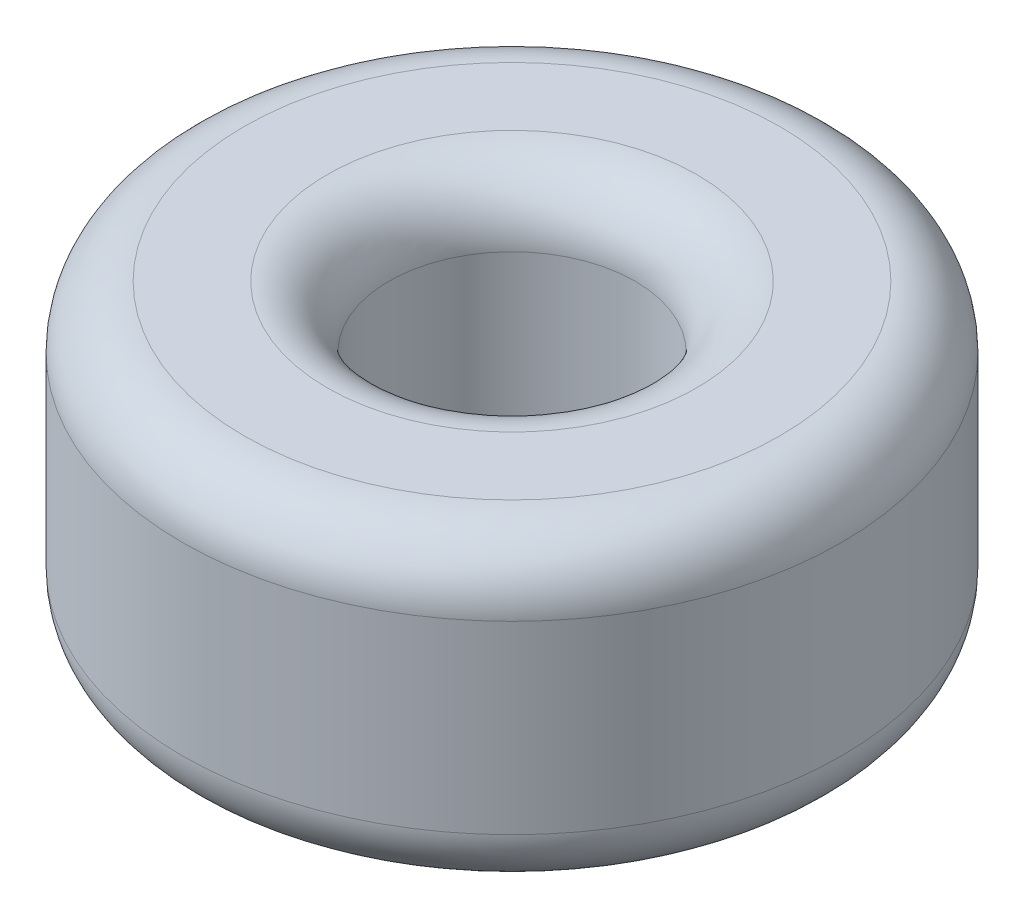
ISO-10303-21;
HEADER;
FILE_DESCRIPTION(('STEP AP214'),'2;1');
FILE_NAME('part.step','',(''),(''),'','','');
FILE_SCHEMA(('AUTOMOTIVE_DESIGN { 1 0 10303 214 1 1 1 1 }'));
ENDSEC;
DATA;
#1=APPLICATION_CONTEXT('core data for automotive mechanical design processes');
#2=APPLICATION_PROTOCOL_DEFINITION('international standard','automotive_design',2000,#1);
#3=PRODUCT_CONTEXT('',#1,'mechanical');
#4=PRODUCT('Part','Part','',(#3));
#5=PRODUCT_RELATED_PRODUCT_CATEGORY('part','',(#4));
#6=PRODUCT_DEFINITION_FORMATION('','',#4);
#7=PRODUCT_DEFINITION_CONTEXT('part definition',#1,'design');
#8=PRODUCT_DEFINITION('design','',#6,#7);
#9=PRODUCT_DEFINITION_SHAPE('','',#8);
#10=(LENGTH_UNIT() NAMED_UNIT(*) SI_UNIT(.MILLI.,.METRE.));
#11=(NAMED_UNIT(*) PLANE_ANGLE_UNIT() SI_UNIT($,.RADIAN.));
#12=(NAMED_UNIT(*) SI_UNIT($,.STERADIAN.) SOLID_ANGLE_UNIT());
#13=UNCERTAINTY_MEASURE_WITH_UNIT(LENGTH_MEASURE(1.E-05),#10,'distance_accuracy_value','');
#14=(GEOMETRIC_REPRESENTATION_CONTEXT(3) GLOBAL_UNCERTAINTY_ASSIGNED_CONTEXT((#13)) GLOBAL_UNIT_ASSIGNED_CONTEXT((#10,
#11,#12)) REPRESENTATION_CONTEXT('',''));
#15=CARTESIAN_POINT('',(0.,0.,0.));
#16=DIRECTION('',(0.,0.,1.));
#17=DIRECTION('',(1.,0.,0.));
#18=AXIS2_PLACEMENT_3D('',#15,#16,#17);
#19=CARTESIAN_POINT('',(0.,50.,0.));
#20=DIRECTION('',(0.,1.,0.));
#21=DIRECTION('',(0.,0.,1.));
#22=AXIS2_PLACEMENT_3D('',#19,#20,#21);
#23=PLANE('',#22);
#24=CARTESIAN_POINT('',(0.,50.,0.));
#25=DIRECTION('',(0.,1.,0.));
#26=DIRECTION('',(0.,0.,1.));
#27=AXIS2_PLACEMENT_3D('',#24,#25,#26);
#28=CIRCLE('',#27,43.5);
#29=CARTESIAN_POINT('',(0.,50.,43.5));
#30=VERTEX_POINT('',#29);
#31=EDGE_CURVE('E10',#30,#30,#28,.T.);
#32=ORIENTED_EDGE('',*,*,#31,.T.);
#33=EDGE_LOOP('',(#32));
#34=FACE_BOUND('',#33,.T.);
#35=CARTESIAN_POINT('',(0.,50.,0.));
#36=DIRECTION('',(0.,1.,0.));
#37=DIRECTION('',(0.,0.,1.));
#38=AXIS2_PLACEMENT_3D('',#35,#36,#37);
#39=CIRCLE('',#38,30.);
#40=CARTESIAN_POINT('',(0.,50.,30.));
#41=VERTEX_POINT('',#40);
#42=EDGE_CURVE('E38',#41,#41,#39,.F.);
#43=ORIENTED_EDGE('',*,*,#42,.T.);
#44=EDGE_LOOP('',(#43));
#45=FACE_BOUND('',#44,.T.);
#46=ADVANCED_FACE('F31',(#34,#45),#23,.T.);
#47=CARTESIAN_POINT('',(0.,0.,0.));
#48=DIRECTION('',(0.,1.,0.));
#49=DIRECTION('',(0.,0.,1.));
#50=AXIS2_PLACEMENT_3D('',#47,#48,#49);
#51=PLANE('',#50);
#52=CARTESIAN_POINT('',(0.,0.,0.));
#53=DIRECTION('',(0.,1.,0.));
#54=DIRECTION('',(0.,0.,1.));
#55=AXIS2_PLACEMENT_3D('',#52,#53,#54);
#56=CIRCLE('',#55,43.5);
#57=CARTESIAN_POINT('',(0.,0.,43.5));
#58=VERTEX_POINT('',#57);
#59=EDGE_CURVE('E51',#58,#58,#56,.F.);
#60=ORIENTED_EDGE('',*,*,#59,.T.);
#61=EDGE_LOOP('',(#60));
#62=FACE_BOUND('',#61,.T.);
#63=CARTESIAN_POINT('',(0.,0.,0.));
#64=DIRECTION('',(0.,1.,0.));
#65=DIRECTION('',(0.,0.,1.));
#66=AXIS2_PLACEMENT_3D('',#63,#64,#65);
#67=CIRCLE('',#66,30.);
#68=CARTESIAN_POINT('',(0.,0.,30.));
#69=VERTEX_POINT('',#68);
#70=EDGE_CURVE('E54',#69,#69,#67,.T.);
#71=ORIENTED_EDGE('',*,*,#70,.T.);
#72=EDGE_LOOP('',(#71));
#73=FACE_BOUND('',#72,.T.);
#74=ADVANCED_FACE('F79',(#62,#73),#51,.F.);
#75=CARTESIAN_POINT('',(0.,50.,0.));
#76=DIRECTION('',(0.,-1.,0.));
#77=DIRECTION('',(0.,0.,-1.));
#78=AXIS2_PLACEMENT_3D('',#75,#76,#77);
#79=CYLINDRICAL_SURFACE('',#78,53.5);
#80=CARTESIAN_POINT('',(0.,10.,0.));
#81=DIRECTION('',(0.,1.,0.));
#82=DIRECTION('',(0.,0.,1.));
#83=AXIS2_PLACEMENT_3D('',#80,#81,#82);
#84=CIRCLE('',#83,53.5);
#85=CARTESIAN_POINT('',(0.,10.,53.5));
#86=VERTEX_POINT('',#85);
#87=EDGE_CURVE('E57',#86,#86,#84,.T.);
#88=ORIENTED_EDGE('',*,*,#87,.T.);
#89=EDGE_LOOP('',(#88));
#90=FACE_BOUND('',#89,.T.);
#91=CARTESIAN_POINT('',(0.,40.,0.));
#92=DIRECTION('',(0.,1.,0.));
#93=DIRECTION('',(0.,0.,1.));
#94=AXIS2_PLACEMENT_3D('',#91,#92,#93);
#95=CIRCLE('',#94,53.5);
#96=CARTESIAN_POINT('',(0.,40.,53.5));
#97=VERTEX_POINT('',#96);
#98=EDGE_CURVE('E60',#97,#97,#95,.F.);
#99=ORIENTED_EDGE('',*,*,#98,.T.);
#100=EDGE_LOOP('',(#99));
#101=FACE_BOUND('',#100,.T.);
#102=ADVANCED_FACE('F64',(#90,#101),#79,.T.);
#103=CARTESIAN_POINT('',(0.,50.,0.));
#104=DIRECTION('',(0.,-1.,0.));
#105=DIRECTION('',(0.,0.,-1.));
#106=AXIS2_PLACEMENT_3D('',#103,#104,#105);
#107=CYLINDRICAL_SURFACE('',#106,20.);
#108=CARTESIAN_POINT('',(0.,10.,0.));
#109=DIRECTION('',(0.,1.,0.));
#110=DIRECTION('',(0.,0.,1.));
#111=AXIS2_PLACEMENT_3D('',#108,#109,#110);
#112=CIRCLE('',#111,20.);
#113=CARTESIAN_POINT('',(0.,10.,20.));
#114=VERTEX_POINT('',#113);
#115=EDGE_CURVE('E42',#114,#114,#112,.F.);
#116=ORIENTED_EDGE('',*,*,#115,.T.);
#117=EDGE_LOOP('',(#116));
#118=FACE_BOUND('',#117,.T.);
#119=CARTESIAN_POINT('',(0.,40.,0.));
#120=DIRECTION('',(0.,1.,0.));
#121=DIRECTION('',(0.,0.,1.));
#122=AXIS2_PLACEMENT_3D('',#119,#120,#121);
#123=CIRCLE('',#122,20.);
#124=CARTESIAN_POINT('',(0.,40.,20.));
#125=VERTEX_POINT('',#124);
#126=EDGE_CURVE('E46',#125,#125,#123,.T.);
#127=ORIENTED_EDGE('',*,*,#126,.T.);
#128=EDGE_LOOP('',(#127));
#129=FACE_BOUND('',#128,.T.);
#130=ADVANCED_FACE('F87',(#118,#129),#107,.F.);
#131=CARTESIAN_POINT('',(0.,10.,0.));
#132=DIRECTION('',(0.,1.,0.));
#133=DIRECTION('',(0.,0.,1.));
#134=AXIS2_PLACEMENT_3D('',#131,#132,#133);
#135=TOROIDAL_SURFACE('',#134,43.5,10.);
#136=ORIENTED_EDGE('',*,*,#59,.F.);
#137=EDGE_LOOP('',(#136));
#138=FACE_BOUND('',#137,.T.);
#139=ORIENTED_EDGE('',*,*,#87,.F.);
#140=EDGE_LOOP('',(#139));
#141=FACE_BOUND('',#140,.T.);
#142=ADVANCED_FACE('F75',(#138,#141),#135,.T.);
#143=CARTESIAN_POINT('',(0.,10.,0.));
#144=DIRECTION('',(0.,1.,0.));
#145=DIRECTION('',(0.,0.,1.));
#146=AXIS2_PLACEMENT_3D('',#143,#144,#145);
#147=TOROIDAL_SURFACE('',#146,30.,10.);
#148=ORIENTED_EDGE('',*,*,#115,.F.);
#149=EDGE_LOOP('',(#148));
#150=FACE_BOUND('',#149,.T.);
#151=ORIENTED_EDGE('',*,*,#70,.F.);
#152=EDGE_LOOP('',(#151));
#153=FACE_BOUND('',#152,.T.);
#154=ADVANCED_FACE('F69',(#150,#153),#147,.T.);
#155=CARTESIAN_POINT('',(0.,40.,0.));
#156=DIRECTION('',(0.,1.,0.));
#157=DIRECTION('',(0.,0.,1.));
#158=AXIS2_PLACEMENT_3D('',#155,#156,#157);
#159=TOROIDAL_SURFACE('',#158,43.5,10.);
#160=ORIENTED_EDGE('',*,*,#98,.F.);
#161=EDGE_LOOP('',(#160));
#162=FACE_BOUND('',#161,.T.);
#163=ORIENTED_EDGE('',*,*,#31,.F.);
#164=EDGE_LOOP('',(#163));
#165=FACE_BOUND('',#164,.T.);
#166=ADVANCED_FACE('F66',(#162,#165),#159,.T.);
#167=CARTESIAN_POINT('',(0.,40.,0.));
#168=DIRECTION('',(0.,1.,0.));
#169=DIRECTION('',(0.,0.,1.));
#170=AXIS2_PLACEMENT_3D('',#167,#168,#169);
#171=TOROIDAL_SURFACE('',#170,30.,10.);
#172=ORIENTED_EDGE('',*,*,#42,.F.);
#173=EDGE_LOOP('',(#172));
#174=FACE_BOUND('',#173,.T.);
#175=ORIENTED_EDGE('',*,*,#126,.F.);
#176=EDGE_LOOP('',(#175));
#177=FACE_BOUND('',#176,.T.);
#178=ADVANCED_FACE('F33',(#174,#177),#171,.T.);
#179=CLOSED_SHELL('',(#46,#74,#102,#130,#142,#154,#166,#178));
#180=MANIFOLD_SOLID_BREP('B2',#179);
#181=ADVANCED_BREP_SHAPE_REPRESENTATION('',(#18,#180),#14);
#182=SHAPE_DEFINITION_REPRESENTATION(#9,#181);
ENDSEC;
END-ISO-10303-21;
